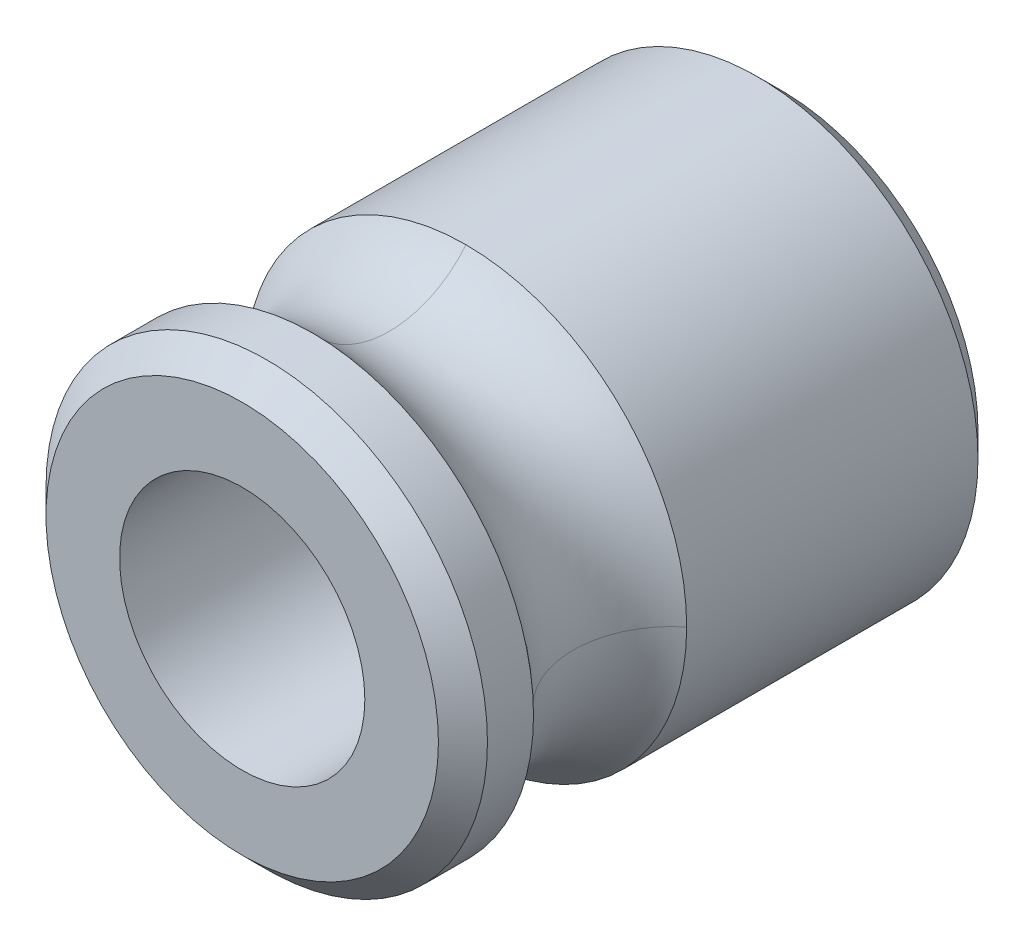
ISO-10303-21;
HEADER;
FILE_DESCRIPTION(('STEP AP214'),'2;1');
FILE_NAME('part.step','',(''),(''),'','','');
FILE_SCHEMA(('AUTOMOTIVE_DESIGN { 1 0 10303 214 1 1 1 1 }'));
ENDSEC;
DATA;
#1=APPLICATION_CONTEXT('core data for automotive mechanical design processes');
#2=APPLICATION_PROTOCOL_DEFINITION('international standard','automotive_design',2000,#1);
#3=PRODUCT_CONTEXT('',#1,'mechanical');
#4=PRODUCT('Part','Part','',(#3));
#5=PRODUCT_RELATED_PRODUCT_CATEGORY('part','',(#4));
#6=PRODUCT_DEFINITION_FORMATION('','',#4);
#7=PRODUCT_DEFINITION_CONTEXT('part definition',#1,'design');
#8=PRODUCT_DEFINITION('design','',#6,#7);
#9=PRODUCT_DEFINITION_SHAPE('','',#8);
#10=(LENGTH_UNIT() NAMED_UNIT(*) SI_UNIT(.MILLI.,.METRE.));
#11=(NAMED_UNIT(*) PLANE_ANGLE_UNIT() SI_UNIT($,.RADIAN.));
#12=(NAMED_UNIT(*) SI_UNIT($,.STERADIAN.) SOLID_ANGLE_UNIT());
#13=UNCERTAINTY_MEASURE_WITH_UNIT(LENGTH_MEASURE(1.E-05),#10,'distance_accuracy_value','');
#14=(GEOMETRIC_REPRESENTATION_CONTEXT(3) GLOBAL_UNCERTAINTY_ASSIGNED_CONTEXT((#13)) GLOBAL_UNIT_ASSIGNED_CONTEXT((#10,
#11,#12)) REPRESENTATION_CONTEXT('',''));
#15=CARTESIAN_POINT('',(0.,0.,0.));
#16=DIRECTION('',(0.,0.,1.));
#17=DIRECTION('',(1.,0.,0.));
#18=AXIS2_PLACEMENT_3D('',#15,#16,#17);
#19=CARTESIAN_POINT('',(0.,0.,11.));
#20=DIRECTION('',(0.,0.,-1.));
#21=DIRECTION('',(-1.,0.,0.));
#22=AXIS2_PLACEMENT_3D('',#19,#20,#21);
#23=CYLINDRICAL_SURFACE('',#22,4.5);
#24=CARTESIAN_POINT('',(0.,0.,10.5));
#25=DIRECTION('',(0.,0.,1.));
#26=DIRECTION('',(1.,0.,0.));
#27=AXIS2_PLACEMENT_3D('',#24,#25,#26);
#28=CIRCLE('',#27,4.5);
#29=CARTESIAN_POINT('',(4.5,0.,10.5));
#30=VERTEX_POINT('',#29);
#31=EDGE_CURVE('E80',#30,#30,#28,.F.);
#32=ORIENTED_EDGE('',*,*,#31,.T.);
#33=EDGE_LOOP('',(#32));
#34=FACE_BOUND('',#33,.T.);
#35=CARTESIAN_POINT('',(0.,0.,9.5612494995996));
#36=DIRECTION('',(0.,0.,-1.));
#37=DIRECTION('',(-1.,0.,0.));
#38=AXIS2_PLACEMENT_3D('',#35,#36,#37);
#39=CIRCLE('',#38,4.5);
#40=CARTESIAN_POINT('',(4.5,0.,9.5612494995996));
#41=VERTEX_POINT('',#40);
#42=CARTESIAN_POINT('',(0.,4.5,9.5612494995996));
#43=VERTEX_POINT('',#42);
#44=EDGE_CURVE('E11',#41,#43,#39,.T.);
#45=ORIENTED_EDGE('',*,*,#44,.F.);
#46=CARTESIAN_POINT('',(0.,0.,9.5612494995996));
#47=DIRECTION('',(0.,0.,-1.));
#48=DIRECTION('',(-1.,0.,0.));
#49=AXIS2_PLACEMENT_3D('',#46,#47,#48);
#50=CIRCLE('',#49,4.5);
#51=EDGE_CURVE('E40',#43,#41,#50,.T.);
#52=ORIENTED_EDGE('',*,*,#51,.F.);
#53=EDGE_LOOP('',(#45,#52));
#54=FACE_BOUND('',#53,.T.);
#55=ADVANCED_FACE('F32',(#34,#54),#23,.T.);
#56=CARTESIAN_POINT('',(0.,0.,0.499999999999997));
#57=DIRECTION('',(0.,0.,1.));
#58=DIRECTION('',(1.,0.,0.));
#59=AXIS2_PLACEMENT_3D('',#56,#57,#58);
#60=CIRCLE('',#59,4.5);
#61=CARTESIAN_POINT('',(4.5,0.,0.499999999999997));
#62=VERTEX_POINT('',#61);
#63=EDGE_CURVE('E77',#62,#62,#60,.T.);
#64=ORIENTED_EDGE('',*,*,#63,.T.);
#65=EDGE_LOOP('',(#64));
#66=FACE_BOUND('',#65,.T.);
#67=CARTESIAN_POINT('',(0.,0.,6.4387505004004));
#68=DIRECTION('',(0.,0.,1.));
#69=DIRECTION('',(1.,0.,0.));
#70=AXIS2_PLACEMENT_3D('',#67,#68,#69);
#71=CIRCLE('',#70,4.5);
#72=CARTESIAN_POINT('',(0.,4.5,6.4387505004004));
#73=VERTEX_POINT('',#72);
#74=CARTESIAN_POINT('',(4.5,0.,6.4387505004004));
#75=VERTEX_POINT('',#74);
#76=EDGE_CURVE('E61',#73,#75,#71,.T.);
#77=ORIENTED_EDGE('',*,*,#76,.F.);
#78=CARTESIAN_POINT('',(0.,0.,6.4387505004004));
#79=DIRECTION('',(0.,0.,1.));
#80=DIRECTION('',(1.,0.,0.));
#81=AXIS2_PLACEMENT_3D('',#78,#79,#80);
#82=CIRCLE('',#81,4.5);
#83=EDGE_CURVE('E57',#75,#73,#82,.T.);
#84=ORIENTED_EDGE('',*,*,#83,.F.);
#85=EDGE_LOOP('',(#77,#84));
#86=FACE_BOUND('',#85,.T.);
#87=ADVANCED_FACE('F69',(#66,#86),#23,.T.);
#88=CARTESIAN_POINT('',(0.,0.,11.));
#89=DIRECTION('',(0.,0.,1.));
#90=DIRECTION('',(1.,0.,0.));
#91=AXIS2_PLACEMENT_3D('',#88,#89,#90);
#92=PLANE('',#91);
#93=CARTESIAN_POINT('',(0.,0.,11.));
#94=DIRECTION('',(0.,0.,1.));
#95=DIRECTION('',(1.,0.,0.));
#96=AXIS2_PLACEMENT_3D('',#93,#94,#95);
#97=CIRCLE('',#96,4.);
#98=CARTESIAN_POINT('',(4.,0.,11.));
#99=VERTEX_POINT('',#98);
#100=EDGE_CURVE('E62',#99,#99,#97,.T.);
#101=ORIENTED_EDGE('',*,*,#100,.T.);
#102=EDGE_LOOP('',(#101));
#103=FACE_BOUND('',#102,.T.);
#104=CARTESIAN_POINT('',(0.,0.,11.));
#105=DIRECTION('',(0.,0.,1.));
#106=DIRECTION('',(1.,0.,0.));
#107=AXIS2_PLACEMENT_3D('',#104,#105,#106);
#108=CIRCLE('',#107,2.5);
#109=CARTESIAN_POINT('',(2.5,0.,11.));
#110=VERTEX_POINT('',#109);
#111=EDGE_CURVE('E83',#110,#110,#108,.T.);
#112=ORIENTED_EDGE('',*,*,#111,.F.);
#113=EDGE_LOOP('',(#112));
#114=FACE_BOUND('',#113,.T.);
#115=ADVANCED_FACE('F94',(#103,#114),#92,.T.);
#116=CARTESIAN_POINT('',(0.,0.,0.));
#117=DIRECTION('',(0.,0.,1.));
#118=DIRECTION('',(1.,0.,0.));
#119=AXIS2_PLACEMENT_3D('',#116,#117,#118);
#120=PLANE('',#119);
#121=CARTESIAN_POINT('',(0.,0.,0.));
#122=DIRECTION('',(0.,0.,1.));
#123=DIRECTION('',(1.,0.,0.));
#124=AXIS2_PLACEMENT_3D('',#121,#122,#123);
#125=CIRCLE('',#124,4.);
#126=CARTESIAN_POINT('',(4.,0.,0.));
#127=VERTEX_POINT('',#126);
#128=EDGE_CURVE('E74',#127,#127,#125,.F.);
#129=ORIENTED_EDGE('',*,*,#128,.T.);
#130=EDGE_LOOP('',(#129));
#131=FACE_BOUND('',#130,.T.);
#132=CARTESIAN_POINT('',(0.,0.,0.));
#133=DIRECTION('',(0.,0.,1.));
#134=DIRECTION('',(1.,0.,0.));
#135=AXIS2_PLACEMENT_3D('',#132,#133,#134);
#136=CIRCLE('',#135,2.5);
#137=CARTESIAN_POINT('',(2.5,0.,0.));
#138=VERTEX_POINT('',#137);
#139=EDGE_CURVE('E84',#138,#138,#136,.T.);
#140=ORIENTED_EDGE('',*,*,#139,.T.);
#141=EDGE_LOOP('',(#140));
#142=FACE_BOUND('',#141,.T.);
#143=ADVANCED_FACE('F96',(#131,#142),#120,.F.);
#144=CARTESIAN_POINT('',(0.,0.,11.));
#145=DIRECTION('',(0.,0.,-1.));
#146=DIRECTION('',(-1.,0.,0.));
#147=AXIS2_PLACEMENT_3D('',#144,#145,#146);
#148=CYLINDRICAL_SURFACE('',#147,2.5);
#149=ORIENTED_EDGE('',*,*,#111,.T.);
#150=EDGE_LOOP('',(#149));
#151=FACE_BOUND('',#150,.T.);
#152=ORIENTED_EDGE('',*,*,#139,.F.);
#153=EDGE_LOOP('',(#152));
#154=FACE_BOUND('',#153,.T.);
#155=ADVANCED_FACE('F91',(#151,#154),#148,.F.);
#156=CARTESIAN_POINT('',(0.,0.,0.499999999999997));
#157=DIRECTION('',(0.,0.,1.));
#158=DIRECTION('',(1.,0.,0.));
#159=AXIS2_PLACEMENT_3D('',#156,#157,#158);
#160=CONICAL_SURFACE('',#159,4.5,0.785398163397453);
#161=ORIENTED_EDGE('',*,*,#128,.F.);
#162=EDGE_LOOP('',(#161));
#163=FACE_BOUND('',#162,.T.);
#164=ORIENTED_EDGE('',*,*,#63,.F.);
#165=EDGE_LOOP('',(#164));
#166=FACE_BOUND('',#165,.T.);
#167=ADVANCED_FACE('F113',(#163,#166),#160,.T.);
#168=CARTESIAN_POINT('',(0.,0.,11.));
#169=DIRECTION('',(0.,0.,-1.));
#170=DIRECTION('',(-1.,0.,0.));
#171=AXIS2_PLACEMENT_3D('',#168,#169,#170);
#172=CONICAL_SURFACE('',#171,4.,0.785398163397446);
#173=ORIENTED_EDGE('',*,*,#31,.F.);
#174=EDGE_LOOP('',(#173));
#175=FACE_BOUND('',#174,.T.);
#176=ORIENTED_EDGE('',*,*,#100,.F.);
#177=EDGE_LOOP('',(#176));
#178=FACE_BOUND('',#177,.T.);
#179=ADVANCED_FACE('F34',(#175,#178),#172,.T.);
#180=CARTESIAN_POINT('',(0.,0.,8.));
#181=DIRECTION('',(0.,0.,1.));
#182=DIRECTION('',(1.,0.,0.));
#183=AXIS2_PLACEMENT_3D('',#180,#181,#182);
#184=TOROIDAL_SURFACE('',#183,5.75,2.);
#185=ORIENTED_EDGE('',*,*,#44,.T.);
#186=CARTESIAN_POINT('',(0.,5.75,8.));
#187=DIRECTION('',(1.,0.,0.));
#188=DIRECTION('',(0.,0.,-1.));
#189=AXIS2_PLACEMENT_3D('',#186,#187,#188);
#190=CIRCLE('',#189,2.);
#191=EDGE_CURVE('E47',#43,#73,#190,.T.);
#192=ORIENTED_EDGE('',*,*,#191,.T.);
#193=ORIENTED_EDGE('',*,*,#76,.T.);
#194=CARTESIAN_POINT('',(5.75,0.,8.));
#195=DIRECTION('',(0.,-1.,0.));
#196=DIRECTION('',(0.,0.,-1.));
#197=AXIS2_PLACEMENT_3D('',#194,#195,#196);
#198=CIRCLE('',#197,2.);
#199=EDGE_CURVE('E51',#41,#75,#198,.T.);
#200=ORIENTED_EDGE('',*,*,#199,.F.);
#201=EDGE_LOOP('',(#185,#192,#193,#200));
#202=FACE_BOUND('',#201,.T.);
#203=ADVANCED_FACE('F65',(#202),#184,.F.);
#204=CARTESIAN_POINT('',(0.,0.,8.));
#205=DIRECTION('',(0.,0.,1.));
#206=DIRECTION('',(1.,0.,0.));
#207=AXIS2_PLACEMENT_3D('',#204,#205,#206);
#208=TOROIDAL_SURFACE('',#207,5.75,2.);
#209=ORIENTED_EDGE('',*,*,#51,.T.);
#210=ORIENTED_EDGE('',*,*,#199,.T.);
#211=ORIENTED_EDGE('',*,*,#83,.T.);
#212=ORIENTED_EDGE('',*,*,#191,.F.);
#213=EDGE_LOOP('',(#209,#210,#211,#212));
#214=FACE_BOUND('',#213,.T.);
#215=ADVANCED_FACE('F58',(#214),#208,.F.);
#216=CLOSED_SHELL('',(#55,#87,#115,#143,#155,#167,#179,#203,#215));
#217=MANIFOLD_SOLID_BREP('B2',#216);
#218=ADVANCED_BREP_SHAPE_REPRESENTATION('',(#18,#217),#14);
#219=SHAPE_DEFINITION_REPRESENTATION(#9,#218);
ENDSEC;
END-ISO-10303-21;
